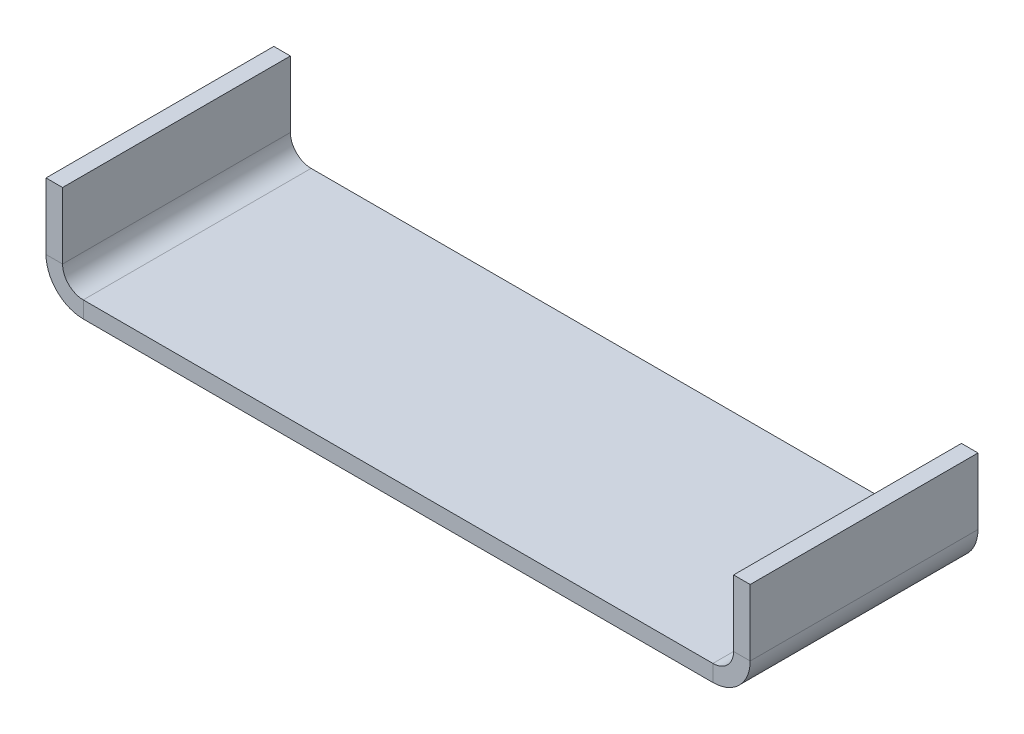
ISO-10303-21;
HEADER;
FILE_DESCRIPTION(('STEP AP214'),'2;1');
FILE_NAME('part.step','',(''),(''),'','','');
FILE_SCHEMA(('AUTOMOTIVE_DESIGN { 1 0 10303 214 1 1 1 1 }'));
ENDSEC;
DATA;
#1=APPLICATION_CONTEXT('core data for automotive mechanical design processes');
#2=APPLICATION_PROTOCOL_DEFINITION('international standard','automotive_design',2000,#1);
#3=PRODUCT_CONTEXT('',#1,'mechanical');
#4=PRODUCT('Part','Part','',(#3));
#5=PRODUCT_RELATED_PRODUCT_CATEGORY('part','',(#4));
#6=PRODUCT_DEFINITION_FORMATION('','',#4);
#7=PRODUCT_DEFINITION_CONTEXT('part definition',#1,'design');
#8=PRODUCT_DEFINITION('design','',#6,#7);
#9=PRODUCT_DEFINITION_SHAPE('','',#8);
#10=(LENGTH_UNIT() NAMED_UNIT(*) SI_UNIT(.MILLI.,.METRE.));
#11=(NAMED_UNIT(*) PLANE_ANGLE_UNIT() SI_UNIT($,.RADIAN.));
#12=(NAMED_UNIT(*) SI_UNIT($,.STERADIAN.) SOLID_ANGLE_UNIT());
#13=UNCERTAINTY_MEASURE_WITH_UNIT(LENGTH_MEASURE(1.E-05),#10,'distance_accuracy_value','');
#14=(GEOMETRIC_REPRESENTATION_CONTEXT(3) GLOBAL_UNCERTAINTY_ASSIGNED_CONTEXT((#13)) GLOBAL_UNIT_ASSIGNED_CONTEXT((#10,
#11,#12)) REPRESENTATION_CONTEXT('',''));
#15=CARTESIAN_POINT('',(0.,0.,0.));
#16=DIRECTION('',(0.,0.,1.));
#17=DIRECTION('',(1.,0.,0.));
#18=AXIS2_PLACEMENT_3D('',#15,#16,#17);
#19=CARTESIAN_POINT('',(-85.,-8.,-55.));
#20=DIRECTION('',(0.,0.,-1.));
#21=DIRECTION('',(-1.,0.,0.));
#22=AXIS2_PLACEMENT_3D('',#19,#20,#21);
#23=PLANE('',#22);
#24=DIRECTION('',(-1.,0.,0.));
#25=VECTOR('',#24,1.);
#26=CARTESIAN_POINT('',(-85.,0.,-55.));
#27=LINE('',#26,#25);
#28=CARTESIAN_POINT('',(67.,0.,-55.));
#29=VERTEX_POINT('',#28);
#30=CARTESIAN_POINT('',(-237.,0.,-55.));
#31=VERTEX_POINT('',#30);
#32=EDGE_CURVE('E156',#29,#31,#27,.T.);
#33=ORIENTED_EDGE('',*,*,#32,.F.);
#34=DIRECTION('',(0.,-1.,0.));
#35=VECTOR('',#34,1.);
#36=CARTESIAN_POINT('',(67.,0.,-55.));
#37=LINE('',#36,#35);
#38=CARTESIAN_POINT('',(67.,-8.00000000000001,-55.));
#39=VERTEX_POINT('',#38);
#40=EDGE_CURVE('E119',#29,#39,#37,.T.);
#41=ORIENTED_EDGE('',*,*,#40,.T.);
#42=DIRECTION('',(-1.,0.,0.));
#43=VECTOR('',#42,1.);
#44=CARTESIAN_POINT('',(-85.,-8.,-55.));
#45=LINE('',#44,#43);
#46=CARTESIAN_POINT('',(-237.,-8.00000000000001,-55.));
#47=VERTEX_POINT('',#46);
#48=EDGE_CURVE('E64',#39,#47,#45,.T.);
#49=ORIENTED_EDGE('',*,*,#48,.T.);
#50=DIRECTION('',(0.,-1.,0.));
#51=VECTOR('',#50,1.);
#52=CARTESIAN_POINT('',(-237.,0.,-55.));
#53=LINE('',#52,#51);
#54=EDGE_CURVE('E192',#31,#47,#53,.T.);
#55=ORIENTED_EDGE('',*,*,#54,.F.);
#56=EDGE_LOOP('',(#33,#41,#49,#55));
#57=FACE_BOUND('',#56,.T.);
#58=ADVANCED_FACE('F56',(#57),#23,.T.);
#59=CARTESIAN_POINT('',(0.,-8.,0.));
#60=DIRECTION('',(0.,-1.,0.));
#61=DIRECTION('',(0.,0.,-1.));
#62=AXIS2_PLACEMENT_3D('',#59,#60,#61);
#63=PLANE('',#62);
#64=ORIENTED_EDGE('',*,*,#48,.F.);
#65=DIRECTION('',(0.,0.,-1.));
#66=VECTOR('',#65,1.);
#67=CARTESIAN_POINT('',(67.,-8.00000000000001,-55.));
#68=LINE('',#67,#66);
#69=CARTESIAN_POINT('',(67.,-8.,55.));
#70=VERTEX_POINT('',#69);
#71=EDGE_CURVE('E78',#39,#70,#68,.F.);
#72=ORIENTED_EDGE('',*,*,#71,.T.);
#73=DIRECTION('',(1.,0.,0.));
#74=VECTOR('',#73,1.);
#75=CARTESIAN_POINT('',(-85.,-8.,55.));
#76=LINE('',#75,#74);
#77=CARTESIAN_POINT('',(-237.,-8.,55.));
#78=VERTEX_POINT('',#77);
#79=EDGE_CURVE('E13',#78,#70,#76,.T.);
#80=ORIENTED_EDGE('',*,*,#79,.F.);
#81=DIRECTION('',(0.,0.,-1.));
#82=VECTOR('',#81,1.);
#83=CARTESIAN_POINT('',(-237.,-8.00000000000001,-55.));
#84=LINE('',#83,#82);
#85=EDGE_CURVE('E187',#47,#78,#84,.F.);
#86=ORIENTED_EDGE('',*,*,#85,.F.);
#87=EDGE_LOOP('',(#64,#72,#80,#86));
#88=FACE_BOUND('',#87,.T.);
#89=ADVANCED_FACE('F181',(#88),#63,.T.);
#90=CARTESIAN_POINT('',(0.,0.,0.));
#91=DIRECTION('',(0.,-1.,0.));
#92=DIRECTION('',(0.,0.,-1.));
#93=AXIS2_PLACEMENT_3D('',#90,#91,#92);
#94=PLANE('',#93);
#95=DIRECTION('',(0.,0.,-1.));
#96=VECTOR('',#95,1.);
#97=CARTESIAN_POINT('',(67.,0.,-55.));
#98=LINE('',#97,#96);
#99=CARTESIAN_POINT('',(67.,0.,55.));
#100=VERTEX_POINT('',#99);
#101=EDGE_CURVE('E120',#29,#100,#98,.F.);
#102=ORIENTED_EDGE('',*,*,#101,.F.);
#103=ORIENTED_EDGE('',*,*,#32,.T.);
#104=DIRECTION('',(0.,0.,-1.));
#105=VECTOR('',#104,1.);
#106=CARTESIAN_POINT('',(-237.,0.,-55.));
#107=LINE('',#106,#105);
#108=CARTESIAN_POINT('',(-237.,0.,55.));
#109=VERTEX_POINT('',#108);
#110=EDGE_CURVE('E171',#31,#109,#107,.F.);
#111=ORIENTED_EDGE('',*,*,#110,.T.);
#112=DIRECTION('',(1.,0.,0.));
#113=VECTOR('',#112,1.);
#114=CARTESIAN_POINT('',(-85.,0.,55.));
#115=LINE('',#114,#113);
#116=EDGE_CURVE('E59',#109,#100,#115,.T.);
#117=ORIENTED_EDGE('',*,*,#116,.T.);
#118=EDGE_LOOP('',(#102,#103,#111,#117));
#119=FACE_BOUND('',#118,.T.);
#120=ADVANCED_FACE('F168',(#119),#94,.F.);
#121=CARTESIAN_POINT('',(-85.,-8.,55.));
#122=DIRECTION('',(0.,0.,1.));
#123=DIRECTION('',(1.,0.,0.));
#124=AXIS2_PLACEMENT_3D('',#121,#122,#123);
#125=PLANE('',#124);
#126=DIRECTION('',(0.,-1.,0.));
#127=VECTOR('',#126,1.);
#128=CARTESIAN_POINT('',(67.,0.,55.));
#129=LINE('',#128,#127);
#130=EDGE_CURVE('E154',#100,#70,#129,.T.);
#131=ORIENTED_EDGE('',*,*,#130,.F.);
#132=ORIENTED_EDGE('',*,*,#116,.F.);
#133=DIRECTION('',(0.,-1.,0.));
#134=VECTOR('',#133,1.);
#135=CARTESIAN_POINT('',(-237.,0.,55.));
#136=LINE('',#135,#134);
#137=EDGE_CURVE('E147',#109,#78,#136,.T.);
#138=ORIENTED_EDGE('',*,*,#137,.T.);
#139=ORIENTED_EDGE('',*,*,#79,.T.);
#140=EDGE_LOOP('',(#131,#132,#138,#139));
#141=FACE_BOUND('',#140,.T.);
#142=ADVANCED_FACE('F175',(#141),#125,.T.);
#143=CARTESIAN_POINT('',(67.,10.,55.));
#144=DIRECTION('',(0.,0.,1.));
#145=DIRECTION('',(1.,0.,0.));
#146=AXIS2_PLACEMENT_3D('',#143,#144,#145);
#147=PLANE('',#146);
#148=DIRECTION('',(-1.,0.,0.));
#149=VECTOR('',#148,1.);
#150=CARTESIAN_POINT('',(85.,9.99999999999994,55.));
#151=LINE('',#150,#149);
#152=CARTESIAN_POINT('',(77.,9.99999999999997,55.));
#153=VERTEX_POINT('',#152);
#154=CARTESIAN_POINT('',(85.,9.99999999999994,55.));
#155=VERTEX_POINT('',#154);
#156=EDGE_CURVE('E110',#153,#155,#151,.F.);
#157=ORIENTED_EDGE('',*,*,#156,.F.);
#158=CARTESIAN_POINT('',(67.,10.,55.));
#159=DIRECTION('',(0.,0.,-1.));
#160=DIRECTION('',(-1.,0.,0.));
#161=AXIS2_PLACEMENT_3D('',#158,#159,#160);
#162=CIRCLE('',#161,10.);
#163=EDGE_CURVE('E104',#100,#153,#162,.F.);
#164=ORIENTED_EDGE('',*,*,#163,.F.);
#165=ORIENTED_EDGE('',*,*,#130,.T.);
#166=CARTESIAN_POINT('',(67.,10.,55.));
#167=DIRECTION('',(0.,0.,-1.));
#168=DIRECTION('',(-1.,0.,0.));
#169=AXIS2_PLACEMENT_3D('',#166,#167,#168);
#170=CIRCLE('',#169,18.);
#171=EDGE_CURVE('E72',#70,#155,#170,.F.);
#172=ORIENTED_EDGE('',*,*,#171,.T.);
#173=EDGE_LOOP('',(#157,#164,#165,#172));
#174=FACE_BOUND('',#173,.T.);
#175=ADVANCED_FACE('F178',(#174),#147,.T.);
#176=CARTESIAN_POINT('',(67.,10.,-55.));
#177=DIRECTION('',(0.,0.,1.));
#178=DIRECTION('',(1.,0.,0.));
#179=AXIS2_PLACEMENT_3D('',#176,#177,#178);
#180=PLANE('',#179);
#181=CARTESIAN_POINT('',(67.,10.,-55.));
#182=DIRECTION('',(0.,0.,-1.));
#183=DIRECTION('',(-1.,0.,0.));
#184=AXIS2_PLACEMENT_3D('',#181,#182,#183);
#185=CIRCLE('',#184,10.);
#186=CARTESIAN_POINT('',(77.,9.99999999999997,-55.));
#187=VERTEX_POINT('',#186);
#188=EDGE_CURVE('E101',#187,#29,#185,.T.);
#189=ORIENTED_EDGE('',*,*,#188,.F.);
#190=DIRECTION('',(-1.,0.,0.));
#191=VECTOR('',#190,1.);
#192=CARTESIAN_POINT('',(77.,9.99999999999997,-55.));
#193=LINE('',#192,#191);
#194=CARTESIAN_POINT('',(85.,9.99999999999994,-55.));
#195=VERTEX_POINT('',#194);
#196=EDGE_CURVE('E109',#187,#195,#193,.F.);
#197=ORIENTED_EDGE('',*,*,#196,.T.);
#198=CARTESIAN_POINT('',(67.,10.,-55.));
#199=DIRECTION('',(0.,0.,-1.));
#200=DIRECTION('',(-1.,0.,0.));
#201=AXIS2_PLACEMENT_3D('',#198,#199,#200);
#202=CIRCLE('',#201,18.);
#203=EDGE_CURVE('E149',#195,#39,#202,.T.);
#204=ORIENTED_EDGE('',*,*,#203,.T.);
#205=ORIENTED_EDGE('',*,*,#40,.F.);
#206=EDGE_LOOP('',(#189,#197,#204,#205));
#207=FACE_BOUND('',#206,.T.);
#208=ADVANCED_FACE('F115',(#207),#180,.F.);
#209=CARTESIAN_POINT('',(67.,10.,-55.));
#210=DIRECTION('',(0.,0.,-1.));
#211=DIRECTION('',(1.,0.,0.));
#212=AXIS2_PLACEMENT_3D('',#209,#210,#211);
#213=CYLINDRICAL_SURFACE('',#212,18.);
#214=ORIENTED_EDGE('',*,*,#71,.F.);
#215=ORIENTED_EDGE('',*,*,#203,.F.);
#216=DIRECTION('',(0.,0.,-1.));
#217=VECTOR('',#216,1.);
#218=CARTESIAN_POINT('',(85.,9.99999999999994,55.));
#219=LINE('',#218,#217);
#220=EDGE_CURVE('E133',#195,#155,#219,.F.);
#221=ORIENTED_EDGE('',*,*,#220,.T.);
#222=ORIENTED_EDGE('',*,*,#171,.F.);
#223=EDGE_LOOP('',(#214,#215,#221,#222));
#224=FACE_BOUND('',#223,.T.);
#225=ADVANCED_FACE('F281',(#224),#213,.T.);
#226=CARTESIAN_POINT('',(67.,10.,-55.));
#227=DIRECTION('',(0.,0.,-1.));
#228=DIRECTION('',(1.,0.,0.));
#229=AXIS2_PLACEMENT_3D('',#226,#227,#228);
#230=CYLINDRICAL_SURFACE('',#229,10.);
#231=ORIENTED_EDGE('',*,*,#101,.T.);
#232=ORIENTED_EDGE('',*,*,#163,.T.);
#233=DIRECTION('',(0.,0.,-1.));
#234=VECTOR('',#233,1.);
#235=CARTESIAN_POINT('',(77.,9.99999999999997,55.));
#236=LINE('',#235,#234);
#237=EDGE_CURVE('E98',#153,#187,#236,.T.);
#238=ORIENTED_EDGE('',*,*,#237,.T.);
#239=ORIENTED_EDGE('',*,*,#188,.T.);
#240=EDGE_LOOP('',(#231,#232,#238,#239));
#241=FACE_BOUND('',#240,.T.);
#242=ADVANCED_FACE('F100',(#241),#230,.F.);
#243=CARTESIAN_POINT('',(85.0000000000002,42.,-55.));
#244=DIRECTION('',(0.,0.,1.));
#245=DIRECTION('',(0.,-1.,0.));
#246=AXIS2_PLACEMENT_3D('',#243,#244,#245);
#247=PLANE('',#246);
#248=ORIENTED_EDGE('',*,*,#196,.F.);
#249=DIRECTION('',(0.,-1.,0.));
#250=VECTOR('',#249,1.);
#251=CARTESIAN_POINT('',(77.0000000000002,42.,-55.));
#252=LINE('',#251,#250);
#253=CARTESIAN_POINT('',(77.0000000000002,42.,-55.));
#254=VERTEX_POINT('',#253);
#255=EDGE_CURVE('E129',#187,#254,#252,.F.);
#256=ORIENTED_EDGE('',*,*,#255,.T.);
#257=DIRECTION('',(-1.,0.,0.));
#258=VECTOR('',#257,1.);
#259=CARTESIAN_POINT('',(85.0000000000002,42.,-55.));
#260=LINE('',#259,#258);
#261=CARTESIAN_POINT('',(85.0000000000001,42.,-55.));
#262=VERTEX_POINT('',#261);
#263=EDGE_CURVE('E121',#262,#254,#260,.T.);
#264=ORIENTED_EDGE('',*,*,#263,.F.);
#265=DIRECTION('',(0.,1.,0.));
#266=VECTOR('',#265,1.);
#267=CARTESIAN_POINT('',(85.,-3.18704547636381E-13,-55.));
#268=LINE('',#267,#266);
#269=EDGE_CURVE('E132',#195,#262,#268,.T.);
#270=ORIENTED_EDGE('',*,*,#269,.F.);
#271=EDGE_LOOP('',(#248,#256,#264,#270));
#272=FACE_BOUND('',#271,.T.);
#273=ADVANCED_FACE('F126',(#272),#247,.F.);
#274=CARTESIAN_POINT('',(85.,0.,55.));
#275=DIRECTION('',(0.,0.,-1.));
#276=DIRECTION('',(0.,1.,0.));
#277=AXIS2_PLACEMENT_3D('',#274,#275,#276);
#278=PLANE('',#277);
#279=ORIENTED_EDGE('',*,*,#156,.T.);
#280=DIRECTION('',(0.,-1.,0.));
#281=VECTOR('',#280,1.);
#282=CARTESIAN_POINT('',(85.,-3.45964487973159E-13,55.));
#283=LINE('',#282,#281);
#284=CARTESIAN_POINT('',(85.0000000000001,42.,55.));
#285=VERTEX_POINT('',#284);
#286=EDGE_CURVE('E225',#285,#155,#283,.T.);
#287=ORIENTED_EDGE('',*,*,#286,.F.);
#288=DIRECTION('',(-1.,0.,0.));
#289=VECTOR('',#288,1.);
#290=CARTESIAN_POINT('',(85.0000000000001,42.,55.));
#291=LINE('',#290,#289);
#292=CARTESIAN_POINT('',(77.0000000000002,42.,55.));
#293=VERTEX_POINT('',#292);
#294=EDGE_CURVE('E222',#285,#293,#291,.T.);
#295=ORIENTED_EDGE('',*,*,#294,.T.);
#296=DIRECTION('',(0.,1.,0.));
#297=VECTOR('',#296,1.);
#298=CARTESIAN_POINT('',(77.,0.,55.));
#299=LINE('',#298,#297);
#300=EDGE_CURVE('E140',#293,#153,#299,.F.);
#301=ORIENTED_EDGE('',*,*,#300,.T.);
#302=EDGE_LOOP('',(#279,#287,#295,#301));
#303=FACE_BOUND('',#302,.T.);
#304=ADVANCED_FACE('F232',(#303),#278,.F.);
#305=CARTESIAN_POINT('',(85.,-3.36877841194233E-13,0.));
#306=DIRECTION('',(-1.,0.,0.));
#307=DIRECTION('',(0.,-1.,0.));
#308=AXIS2_PLACEMENT_3D('',#305,#306,#307);
#309=PLANE('',#308);
#310=ORIENTED_EDGE('',*,*,#220,.F.);
#311=ORIENTED_EDGE('',*,*,#269,.T.);
#312=DIRECTION('',(0.,0.,1.));
#313=VECTOR('',#312,1.);
#314=CARTESIAN_POINT('',(85.0000000000001,42.,0.));
#315=LINE('',#314,#313);
#316=EDGE_CURVE('E228',#262,#285,#315,.T.);
#317=ORIENTED_EDGE('',*,*,#316,.T.);
#318=ORIENTED_EDGE('',*,*,#286,.T.);
#319=EDGE_LOOP('',(#310,#311,#317,#318));
#320=FACE_BOUND('',#319,.T.);
#321=ADVANCED_FACE('F248',(#320),#309,.F.);
#322=CARTESIAN_POINT('',(77.,-3.08945990483488E-13,0.));
#323=DIRECTION('',(-1.,0.,0.));
#324=DIRECTION('',(0.,-1.,0.));
#325=AXIS2_PLACEMENT_3D('',#322,#323,#324);
#326=PLANE('',#325);
#327=ORIENTED_EDGE('',*,*,#255,.F.);
#328=ORIENTED_EDGE('',*,*,#237,.F.);
#329=ORIENTED_EDGE('',*,*,#300,.F.);
#330=DIRECTION('',(0.,0.,-1.));
#331=VECTOR('',#330,1.);
#332=CARTESIAN_POINT('',(77.0000000000002,42.,55.));
#333=LINE('',#332,#331);
#334=EDGE_CURVE('E138',#254,#293,#333,.F.);
#335=ORIENTED_EDGE('',*,*,#334,.F.);
#336=EDGE_LOOP('',(#327,#328,#329,#335));
#337=FACE_BOUND('',#336,.T.);
#338=ADVANCED_FACE('F136',(#337),#326,.T.);
#339=CARTESIAN_POINT('',(85.0000000000002,42.,55.));
#340=DIRECTION('',(0.,-1.,0.));
#341=DIRECTION('',(1.,0.,0.));
#342=AXIS2_PLACEMENT_3D('',#339,#340,#341);
#343=PLANE('',#342);
#344=ORIENTED_EDGE('',*,*,#334,.T.);
#345=ORIENTED_EDGE('',*,*,#294,.F.);
#346=ORIENTED_EDGE('',*,*,#316,.F.);
#347=ORIENTED_EDGE('',*,*,#263,.T.);
#348=EDGE_LOOP('',(#344,#345,#346,#347));
#349=FACE_BOUND('',#348,.T.);
#350=ADVANCED_FACE('F249',(#349),#343,.F.);
#351=CARTESIAN_POINT('',(-237.,10.,55.));
#352=DIRECTION('',(0.,0.,1.));
#353=DIRECTION('',(-1.,0.,0.));
#354=AXIS2_PLACEMENT_3D('',#351,#352,#353);
#355=PLANE('',#354);
#356=DIRECTION('',(1.,0.,0.));
#357=VECTOR('',#356,1.);
#358=CARTESIAN_POINT('',(-255.,9.99999999999994,55.));
#359=LINE('',#358,#357);
#360=CARTESIAN_POINT('',(-247.,9.99999999999997,55.));
#361=VERTEX_POINT('',#360);
#362=CARTESIAN_POINT('',(-255.,9.99999999999994,55.));
#363=VERTEX_POINT('',#362);
#364=EDGE_CURVE('E340',#361,#363,#359,.F.);
#365=ORIENTED_EDGE('',*,*,#364,.T.);
#366=CARTESIAN_POINT('',(-237.,10.,55.));
#367=DIRECTION('',(0.,0.,1.));
#368=DIRECTION('',(1.,0.,0.));
#369=AXIS2_PLACEMENT_3D('',#366,#367,#368);
#370=CIRCLE('',#369,18.);
#371=EDGE_CURVE('E209',#78,#363,#370,.F.);
#372=ORIENTED_EDGE('',*,*,#371,.F.);
#373=ORIENTED_EDGE('',*,*,#137,.F.);
#374=CARTESIAN_POINT('',(-237.,10.,55.));
#375=DIRECTION('',(0.,0.,1.));
#376=DIRECTION('',(1.,0.,0.));
#377=AXIS2_PLACEMENT_3D('',#374,#375,#376);
#378=CIRCLE('',#377,10.);
#379=EDGE_CURVE('E207',#109,#361,#378,.F.);
#380=ORIENTED_EDGE('',*,*,#379,.T.);
#381=EDGE_LOOP('',(#365,#372,#373,#380));
#382=FACE_BOUND('',#381,.T.);
#383=ADVANCED_FACE('F251',(#382),#355,.T.);
#384=CARTESIAN_POINT('',(-237.,10.,-55.));
#385=DIRECTION('',(0.,0.,1.));
#386=DIRECTION('',(-1.,0.,0.));
#387=AXIS2_PLACEMENT_3D('',#384,#385,#386);
#388=PLANE('',#387);
#389=CARTESIAN_POINT('',(-237.,10.,-55.));
#390=DIRECTION('',(0.,0.,1.));
#391=DIRECTION('',(1.,0.,0.));
#392=AXIS2_PLACEMENT_3D('',#389,#390,#391);
#393=CIRCLE('',#392,10.);
#394=CARTESIAN_POINT('',(-247.,9.99999999999997,-55.));
#395=VERTEX_POINT('',#394);
#396=EDGE_CURVE('E216',#395,#31,#393,.T.);
#397=ORIENTED_EDGE('',*,*,#396,.T.);
#398=ORIENTED_EDGE('',*,*,#54,.T.);
#399=CARTESIAN_POINT('',(-237.,10.,-55.));
#400=DIRECTION('',(0.,0.,1.));
#401=DIRECTION('',(1.,0.,0.));
#402=AXIS2_PLACEMENT_3D('',#399,#400,#401);
#403=CIRCLE('',#402,18.);
#404=CARTESIAN_POINT('',(-255.,9.99999999999994,-55.));
#405=VERTEX_POINT('',#404);
#406=EDGE_CURVE('E198',#405,#47,#403,.T.);
#407=ORIENTED_EDGE('',*,*,#406,.F.);
#408=DIRECTION('',(1.,0.,0.));
#409=VECTOR('',#408,1.);
#410=CARTESIAN_POINT('',(-247.,9.99999999999997,-55.));
#411=LINE('',#410,#409);
#412=EDGE_CURVE('E335',#395,#405,#411,.F.);
#413=ORIENTED_EDGE('',*,*,#412,.F.);
#414=EDGE_LOOP('',(#397,#398,#407,#413));
#415=FACE_BOUND('',#414,.T.);
#416=ADVANCED_FACE('F257',(#415),#388,.F.);
#417=CARTESIAN_POINT('',(-237.,10.,-55.));
#418=DIRECTION('',(0.,0.,-1.));
#419=DIRECTION('',(-1.,0.,0.));
#420=AXIS2_PLACEMENT_3D('',#417,#418,#419);
#421=CYLINDRICAL_SURFACE('',#420,18.);
#422=ORIENTED_EDGE('',*,*,#85,.T.);
#423=ORIENTED_EDGE('',*,*,#371,.T.);
#424=DIRECTION('',(0.,0.,-1.));
#425=VECTOR('',#424,1.);
#426=CARTESIAN_POINT('',(-255.,9.99999999999994,55.));
#427=LINE('',#426,#425);
#428=EDGE_CURVE('E203',#405,#363,#427,.F.);
#429=ORIENTED_EDGE('',*,*,#428,.F.);
#430=ORIENTED_EDGE('',*,*,#406,.T.);
#431=EDGE_LOOP('',(#422,#423,#429,#430));
#432=FACE_BOUND('',#431,.T.);
#433=ADVANCED_FACE('F199',(#432),#421,.T.);
#434=CARTESIAN_POINT('',(-237.,10.,-55.));
#435=DIRECTION('',(0.,0.,-1.));
#436=DIRECTION('',(-1.,0.,0.));
#437=AXIS2_PLACEMENT_3D('',#434,#435,#436);
#438=CYLINDRICAL_SURFACE('',#437,10.);
#439=ORIENTED_EDGE('',*,*,#110,.F.);
#440=ORIENTED_EDGE('',*,*,#396,.F.);
#441=DIRECTION('',(0.,0.,-1.));
#442=VECTOR('',#441,1.);
#443=CARTESIAN_POINT('',(-247.,9.99999999999997,55.));
#444=LINE('',#443,#442);
#445=EDGE_CURVE('E343',#361,#395,#444,.T.);
#446=ORIENTED_EDGE('',*,*,#445,.F.);
#447=ORIENTED_EDGE('',*,*,#379,.F.);
#448=EDGE_LOOP('',(#439,#440,#446,#447));
#449=FACE_BOUND('',#448,.T.);
#450=ADVANCED_FACE('F297',(#449),#438,.F.);
#451=CARTESIAN_POINT('',(-255.,42.,-55.));
#452=DIRECTION('',(0.,0.,1.));
#453=DIRECTION('',(0.,-1.,0.));
#454=AXIS2_PLACEMENT_3D('',#451,#452,#453);
#455=PLANE('',#454);
#456=ORIENTED_EDGE('',*,*,#412,.T.);
#457=DIRECTION('',(0.,1.,0.));
#458=VECTOR('',#457,1.);
#459=CARTESIAN_POINT('',(-255.,-3.18704547636381E-13,-55.));
#460=LINE('',#459,#458);
#461=CARTESIAN_POINT('',(-255.,42.,-55.));
#462=VERTEX_POINT('',#461);
#463=EDGE_CURVE('E332',#405,#462,#460,.T.);
#464=ORIENTED_EDGE('',*,*,#463,.T.);
#465=DIRECTION('',(1.,0.,0.));
#466=VECTOR('',#465,1.);
#467=CARTESIAN_POINT('',(-255.,42.,-55.));
#468=LINE('',#467,#466);
#469=CARTESIAN_POINT('',(-247.,42.,-55.));
#470=VERTEX_POINT('',#469);
#471=EDGE_CURVE('E218',#462,#470,#468,.T.);
#472=ORIENTED_EDGE('',*,*,#471,.T.);
#473=DIRECTION('',(0.,-1.,0.));
#474=VECTOR('',#473,1.);
#475=CARTESIAN_POINT('',(-247.,42.,-55.));
#476=LINE('',#475,#474);
#477=EDGE_CURVE('E334',#395,#470,#476,.F.);
#478=ORIENTED_EDGE('',*,*,#477,.F.);
#479=EDGE_LOOP('',(#456,#464,#472,#478));
#480=FACE_BOUND('',#479,.T.);
#481=ADVANCED_FACE('F300',(#480),#455,.F.);
#482=CARTESIAN_POINT('',(-255.,0.,55.));
#483=DIRECTION('',(0.,0.,-1.));
#484=DIRECTION('',(0.,1.,0.));
#485=AXIS2_PLACEMENT_3D('',#482,#483,#484);
#486=PLANE('',#485);
#487=ORIENTED_EDGE('',*,*,#364,.F.);
#488=DIRECTION('',(0.,1.,0.));
#489=VECTOR('',#488,1.);
#490=CARTESIAN_POINT('',(-247.,0.,55.));
#491=LINE('',#490,#489);
#492=CARTESIAN_POINT('',(-247.,42.,55.));
#493=VERTEX_POINT('',#492);
#494=EDGE_CURVE('E354',#493,#361,#491,.F.);
#495=ORIENTED_EDGE('',*,*,#494,.F.);
#496=DIRECTION('',(1.,0.,0.));
#497=VECTOR('',#496,1.);
#498=CARTESIAN_POINT('',(-255.,42.,55.));
#499=LINE('',#498,#497);
#500=CARTESIAN_POINT('',(-255.,42.,55.));
#501=VERTEX_POINT('',#500);
#502=EDGE_CURVE('E362',#501,#493,#499,.T.);
#503=ORIENTED_EDGE('',*,*,#502,.F.);
#504=DIRECTION('',(0.,-1.,0.));
#505=VECTOR('',#504,1.);
#506=CARTESIAN_POINT('',(-255.,-3.45964487973159E-13,55.));
#507=LINE('',#506,#505);
#508=EDGE_CURVE('E329',#501,#363,#507,.T.);
#509=ORIENTED_EDGE('',*,*,#508,.T.);
#510=EDGE_LOOP('',(#487,#495,#503,#509));
#511=FACE_BOUND('',#510,.T.);
#512=ADVANCED_FACE('F306',(#511),#486,.F.);
#513=CARTESIAN_POINT('',(-255.,-3.36877841194233E-13,0.));
#514=DIRECTION('',(1.,0.,0.));
#515=DIRECTION('',(0.,-1.,0.));
#516=AXIS2_PLACEMENT_3D('',#513,#514,#515);
#517=PLANE('',#516);
#518=ORIENTED_EDGE('',*,*,#428,.T.);
#519=ORIENTED_EDGE('',*,*,#508,.F.);
#520=DIRECTION('',(0.,0.,1.));
#521=VECTOR('',#520,1.);
#522=CARTESIAN_POINT('',(-255.,42.,0.));
#523=LINE('',#522,#521);
#524=EDGE_CURVE('E358',#462,#501,#523,.T.);
#525=ORIENTED_EDGE('',*,*,#524,.F.);
#526=ORIENTED_EDGE('',*,*,#463,.F.);
#527=EDGE_LOOP('',(#518,#519,#525,#526));
#528=FACE_BOUND('',#527,.T.);
#529=ADVANCED_FACE('F315',(#528),#517,.F.);
#530=CARTESIAN_POINT('',(-247.,-3.08945990483488E-13,0.));
#531=DIRECTION('',(1.,0.,0.));
#532=DIRECTION('',(0.,-1.,0.));
#533=AXIS2_PLACEMENT_3D('',#530,#531,#532);
#534=PLANE('',#533);
#535=ORIENTED_EDGE('',*,*,#477,.T.);
#536=DIRECTION('',(0.,0.,-1.));
#537=VECTOR('',#536,1.);
#538=CARTESIAN_POINT('',(-247.,42.,55.));
#539=LINE('',#538,#537);
#540=EDGE_CURVE('E351',#470,#493,#539,.F.);
#541=ORIENTED_EDGE('',*,*,#540,.T.);
#542=ORIENTED_EDGE('',*,*,#494,.T.);
#543=ORIENTED_EDGE('',*,*,#445,.T.);
#544=EDGE_LOOP('',(#535,#541,#542,#543));
#545=FACE_BOUND('',#544,.T.);
#546=ADVANCED_FACE('F311',(#545),#534,.T.);
#547=CARTESIAN_POINT('',(-255.,42.,55.));
#548=DIRECTION('',(0.,-1.,0.));
#549=DIRECTION('',(-1.,0.,0.));
#550=AXIS2_PLACEMENT_3D('',#547,#548,#549);
#551=PLANE('',#550);
#552=ORIENTED_EDGE('',*,*,#540,.F.);
#553=ORIENTED_EDGE('',*,*,#471,.F.);
#554=ORIENTED_EDGE('',*,*,#524,.T.);
#555=ORIENTED_EDGE('',*,*,#502,.T.);
#556=EDGE_LOOP('',(#552,#553,#554,#555));
#557=FACE_BOUND('',#556,.T.);
#558=ADVANCED_FACE('F308',(#557),#551,.F.);
#559=CLOSED_SHELL('',(#58,#89,#120,#142,#175,#208,#225,#242,#273,#304,#321,#338,#350,#383,#416,
#433,#450,#481,#512,#529,#546,#558));
#560=MANIFOLD_SOLID_BREP('B2',#559);
#561=ADVANCED_BREP_SHAPE_REPRESENTATION('',(#18,#560),#14);
#562=SHAPE_DEFINITION_REPRESENTATION(#9,#561);
ENDSEC;
END-ISO-10303-21;
